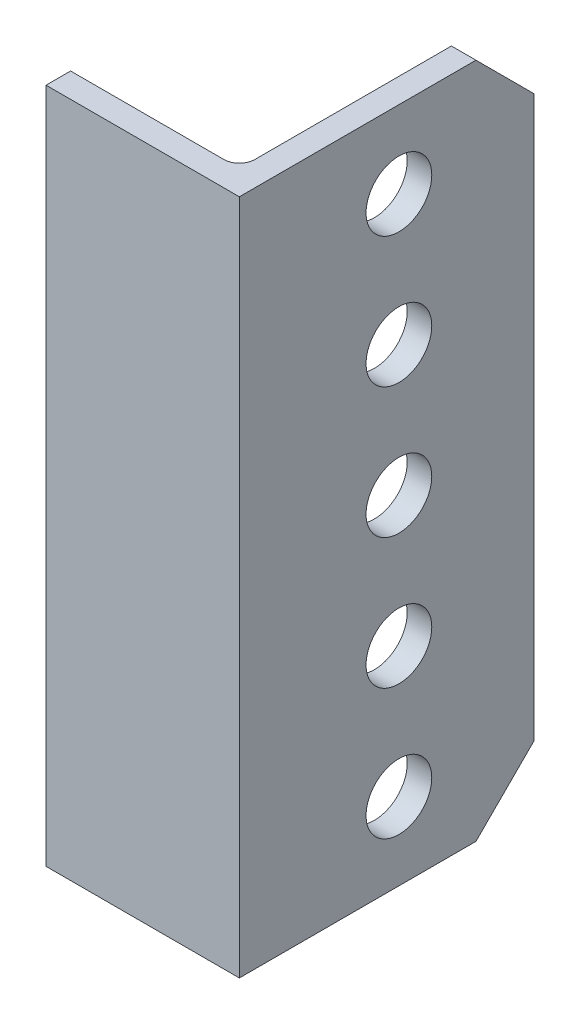
ISO-10303-21;
HEADER;
FILE_DESCRIPTION(('STEP AP214'),'2;1');
FILE_NAME('part.step','',(''),(''),'','','');
FILE_SCHEMA(('AUTOMOTIVE_DESIGN { 1 0 10303 214 1 1 1 1 }'));
ENDSEC;
DATA;
#1=APPLICATION_CONTEXT('core data for automotive mechanical design processes');
#2=APPLICATION_PROTOCOL_DEFINITION('international standard','automotive_design',2000,#1);
#3=PRODUCT_CONTEXT('',#1,'mechanical');
#4=PRODUCT('Part','Part','',(#3));
#5=PRODUCT_RELATED_PRODUCT_CATEGORY('part','',(#4));
#6=PRODUCT_DEFINITION_FORMATION('','',#4);
#7=PRODUCT_DEFINITION_CONTEXT('part definition',#1,'design');
#8=PRODUCT_DEFINITION('design','',#6,#7);
#9=PRODUCT_DEFINITION_SHAPE('','',#8);
#10=(LENGTH_UNIT() NAMED_UNIT(*) SI_UNIT(.MILLI.,.METRE.));
#11=(NAMED_UNIT(*) PLANE_ANGLE_UNIT() SI_UNIT($,.RADIAN.));
#12=(NAMED_UNIT(*) SI_UNIT($,.STERADIAN.) SOLID_ANGLE_UNIT());
#13=UNCERTAINTY_MEASURE_WITH_UNIT(LENGTH_MEASURE(1.E-05),#10,'distance_accuracy_value','');
#14=(GEOMETRIC_REPRESENTATION_CONTEXT(3) GLOBAL_UNCERTAINTY_ASSIGNED_CONTEXT((#13)) GLOBAL_UNIT_ASSIGNED_CONTEXT((#10,
#11,#12)) REPRESENTATION_CONTEXT('',''));
#15=CARTESIAN_POINT('',(0.,0.,0.));
#16=DIRECTION('',(0.,0.,1.));
#17=DIRECTION('',(1.,0.,0.));
#18=AXIS2_PLACEMENT_3D('',#15,#16,#17);
#19=CARTESIAN_POINT('',(-50.,87.5,-6.35));
#20=DIRECTION('',(1.,0.,0.));
#21=DIRECTION('',(0.,0.,-1.));
#22=AXIS2_PLACEMENT_3D('',#19,#20,#21);
#23=PLANE('',#22);
#24=DIRECTION('',(0.,0.,1.));
#25=VECTOR('',#24,1.);
#26=CARTESIAN_POINT('',(-50.,-87.5,-6.35));
#27=LINE('',#26,#25);
#28=CARTESIAN_POINT('',(-50.,-87.5,-6.35));
#29=VERTEX_POINT('',#28);
#30=CARTESIAN_POINT('',(-50.,-87.5,0.));
#31=VERTEX_POINT('',#30);
#32=EDGE_CURVE('E148',#29,#31,#27,.T.);
#33=ORIENTED_EDGE('',*,*,#32,.T.);
#34=DIRECTION('',(0.,-1.,0.));
#35=VECTOR('',#34,1.);
#36=CARTESIAN_POINT('',(-50.,87.5,0.));
#37=LINE('',#36,#35);
#38=CARTESIAN_POINT('',(-50.,87.5,0.));
#39=VERTEX_POINT('',#38);
#40=EDGE_CURVE('E178',#39,#31,#37,.T.);
#41=ORIENTED_EDGE('',*,*,#40,.F.);
#42=DIRECTION('',(0.,0.,1.));
#43=VECTOR('',#42,1.);
#44=CARTESIAN_POINT('',(-50.,87.5,-6.35));
#45=LINE('',#44,#43);
#46=CARTESIAN_POINT('',(-50.,87.5,-6.35));
#47=VERTEX_POINT('',#46);
#48=EDGE_CURVE('E140',#47,#39,#45,.T.);
#49=ORIENTED_EDGE('',*,*,#48,.F.);
#50=DIRECTION('',(0.,-1.,0.));
#51=VECTOR('',#50,1.);
#52=CARTESIAN_POINT('',(-50.,87.5,-6.35));
#53=LINE('',#52,#51);
#54=EDGE_CURVE('E147',#47,#29,#53,.T.);
#55=ORIENTED_EDGE('',*,*,#54,.T.);
#56=EDGE_LOOP('',(#33,#41,#49,#55));
#57=FACE_BOUND('',#56,.T.);
#58=ADVANCED_FACE('F39',(#57),#23,.F.);
#59=CARTESIAN_POINT('',(-50.,87.5,0.));
#60=DIRECTION('',(0.,0.,-1.));
#61=DIRECTION('',(-1.,0.,0.));
#62=AXIS2_PLACEMENT_3D('',#59,#60,#61);
#63=PLANE('',#62);
#64=DIRECTION('',(1.,0.,0.));
#65=VECTOR('',#64,1.);
#66=CARTESIAN_POINT('',(-50.,-87.5,0.));
#67=LINE('',#66,#65);
#68=CARTESIAN_POINT('',(0.,-87.5,0.));
#69=VERTEX_POINT('',#68);
#70=EDGE_CURVE('E151',#31,#69,#67,.T.);
#71=ORIENTED_EDGE('',*,*,#70,.T.);
#72=DIRECTION('',(0.,-1.,0.));
#73=VECTOR('',#72,1.);
#74=CARTESIAN_POINT('',(0.,87.5,0.));
#75=LINE('',#74,#73);
#76=CARTESIAN_POINT('',(0.,87.5,0.));
#77=VERTEX_POINT('',#76);
#78=EDGE_CURVE('E176',#77,#69,#75,.T.);
#79=ORIENTED_EDGE('',*,*,#78,.F.);
#80=DIRECTION('',(1.,0.,0.));
#81=VECTOR('',#80,1.);
#82=CARTESIAN_POINT('',(-50.,87.5,0.));
#83=LINE('',#82,#81);
#84=EDGE_CURVE('E134',#39,#77,#83,.T.);
#85=ORIENTED_EDGE('',*,*,#84,.F.);
#86=ORIENTED_EDGE('',*,*,#40,.T.);
#87=EDGE_LOOP('',(#71,#79,#85,#86));
#88=FACE_BOUND('',#87,.T.);
#89=ADVANCED_FACE('F214',(#88),#63,.F.);
#90=CARTESIAN_POINT('',(0.,87.5,0.));
#91=DIRECTION('',(-1.,0.,0.));
#92=DIRECTION('',(0.,0.,1.));
#93=AXIS2_PLACEMENT_3D('',#90,#91,#92);
#94=PLANE('',#93);
#95=CARTESIAN_POINT('',(0.,-67.5,-41.27));
#96=DIRECTION('',(1.,0.,0.));
#97=DIRECTION('',(0.,0.,-1.));
#98=AXIS2_PLACEMENT_3D('',#95,#96,#97);
#99=CIRCLE('',#98,8.49999999999999);
#100=CARTESIAN_POINT('',(0.,-67.5,-49.77));
#101=VERTEX_POINT('',#100);
#102=EDGE_CURVE('E129',#101,#101,#99,.T.);
#103=ORIENTED_EDGE('',*,*,#102,.F.);
#104=EDGE_LOOP('',(#103));
#105=FACE_BOUND('',#104,.T.);
#106=CARTESIAN_POINT('',(0.,-33.75,-41.27));
#107=DIRECTION('',(1.,0.,0.));
#108=DIRECTION('',(0.,0.,-1.));
#109=AXIS2_PLACEMENT_3D('',#106,#107,#108);
#110=CIRCLE('',#109,8.5);
#111=CARTESIAN_POINT('',(0.,-33.75,-49.77));
#112=VERTEX_POINT('',#111);
#113=EDGE_CURVE('E250',#112,#112,#110,.T.);
#114=ORIENTED_EDGE('',*,*,#113,.F.);
#115=EDGE_LOOP('',(#114));
#116=FACE_BOUND('',#115,.T.);
#117=CARTESIAN_POINT('',(0.,0.,-41.27));
#118=DIRECTION('',(1.,0.,0.));
#119=DIRECTION('',(0.,0.,-1.));
#120=AXIS2_PLACEMENT_3D('',#117,#118,#119);
#121=CIRCLE('',#120,8.5);
#122=CARTESIAN_POINT('',(0.,0.,-49.77));
#123=VERTEX_POINT('',#122);
#124=EDGE_CURVE('E253',#123,#123,#121,.T.);
#125=ORIENTED_EDGE('',*,*,#124,.F.);
#126=EDGE_LOOP('',(#125));
#127=FACE_BOUND('',#126,.T.);
#128=CARTESIAN_POINT('',(0.,33.75,-41.27));
#129=DIRECTION('',(1.,0.,0.));
#130=DIRECTION('',(0.,0.,-1.));
#131=AXIS2_PLACEMENT_3D('',#128,#129,#130);
#132=CIRCLE('',#131,8.5);
#133=CARTESIAN_POINT('',(0.,33.75,-49.77));
#134=VERTEX_POINT('',#133);
#135=EDGE_CURVE('E244',#134,#134,#132,.T.);
#136=ORIENTED_EDGE('',*,*,#135,.F.);
#137=EDGE_LOOP('',(#136));
#138=FACE_BOUND('',#137,.T.);
#139=CARTESIAN_POINT('',(0.,67.5,-41.27));
#140=DIRECTION('',(1.,0.,0.));
#141=DIRECTION('',(0.,0.,-1.));
#142=AXIS2_PLACEMENT_3D('',#139,#140,#141);
#143=CIRCLE('',#142,8.49999999999999);
#144=CARTESIAN_POINT('',(0.,67.5,-49.77));
#145=VERTEX_POINT('',#144);
#146=EDGE_CURVE('E241',#145,#145,#143,.T.);
#147=ORIENTED_EDGE('',*,*,#146,.F.);
#148=EDGE_LOOP('',(#147));
#149=FACE_BOUND('',#148,.T.);
#150=DIRECTION('',(0.,0.,-1.));
#151=VECTOR('',#150,1.);
#152=CARTESIAN_POINT('',(0.,-87.5,0.));
#153=LINE('',#152,#151);
#154=CARTESIAN_POINT('',(0.,-87.5,-61.2));
#155=VERTEX_POINT('',#154);
#156=EDGE_CURVE('E153',#69,#155,#153,.T.);
#157=ORIENTED_EDGE('',*,*,#156,.T.);
#158=DIRECTION('',(0.,-0.707106781186548,0.707106781186547));
#159=VECTOR('',#158,1.);
#160=CARTESIAN_POINT('',(0.,-87.5,-61.2));
#161=LINE('',#160,#159);
#162=CARTESIAN_POINT('',(0.,-72.5,-76.2));
#163=VERTEX_POINT('',#162);
#164=EDGE_CURVE('E62',#163,#155,#161,.T.);
#165=ORIENTED_EDGE('',*,*,#164,.F.);
#166=DIRECTION('',(0.,-1.,0.));
#167=VECTOR('',#166,1.);
#168=CARTESIAN_POINT('',(0.,87.5,-76.2));
#169=LINE('',#168,#167);
#170=CARTESIAN_POINT('',(0.,72.5,-76.2));
#171=VERTEX_POINT('',#170);
#172=EDGE_CURVE('E128',#171,#163,#169,.T.);
#173=ORIENTED_EDGE('',*,*,#172,.F.);
#174=DIRECTION('',(0.,-0.707106781186548,-0.707106781186547));
#175=VECTOR('',#174,1.);
#176=CARTESIAN_POINT('',(0.,72.5,-76.2));
#177=LINE('',#176,#175);
#178=CARTESIAN_POINT('',(0.,87.5,-61.2));
#179=VERTEX_POINT('',#178);
#180=EDGE_CURVE('E115',#179,#171,#177,.T.);
#181=ORIENTED_EDGE('',*,*,#180,.F.);
#182=DIRECTION('',(0.,0.,-1.));
#183=VECTOR('',#182,1.);
#184=CARTESIAN_POINT('',(0.,87.5,0.));
#185=LINE('',#184,#183);
#186=EDGE_CURVE('E126',#77,#179,#185,.T.);
#187=ORIENTED_EDGE('',*,*,#186,.F.);
#188=ORIENTED_EDGE('',*,*,#78,.T.);
#189=EDGE_LOOP('',(#157,#165,#173,#181,#187,#188));
#190=FACE_BOUND('',#189,.T.);
#191=ADVANCED_FACE('F124',(#105,#116,#127,#138,#149,#190),#94,.F.);
#192=CARTESIAN_POINT('',(0.,87.5,-76.2));
#193=DIRECTION('',(0.,0.,1.));
#194=DIRECTION('',(1.,0.,0.));
#195=AXIS2_PLACEMENT_3D('',#192,#193,#194);
#196=PLANE('',#195);
#197=ORIENTED_EDGE('',*,*,#172,.T.);
#198=DIRECTION('',(1.,0.,0.));
#199=VECTOR('',#198,1.);
#200=CARTESIAN_POINT('',(-50.,-72.5,-76.2));
#201=LINE('',#200,#199);
#202=CARTESIAN_POINT('',(-2.35,-72.5,-76.2));
#203=VERTEX_POINT('',#202);
#204=EDGE_CURVE('E246',#203,#163,#201,.T.);
#205=ORIENTED_EDGE('',*,*,#204,.F.);
#206=DIRECTION('',(0.,-1.,0.));
#207=VECTOR('',#206,1.);
#208=CARTESIAN_POINT('',(-2.34999999999997,87.5,-76.2));
#209=LINE('',#208,#207);
#210=CARTESIAN_POINT('',(-2.35,72.5,-76.2));
#211=VERTEX_POINT('',#210);
#212=EDGE_CURVE('E172',#211,#203,#209,.T.);
#213=ORIENTED_EDGE('',*,*,#212,.F.);
#214=DIRECTION('',(1.,0.,0.));
#215=VECTOR('',#214,1.);
#216=CARTESIAN_POINT('',(-50.,72.5,-76.2));
#217=LINE('',#216,#215);
#218=EDGE_CURVE('E130',#211,#171,#217,.T.);
#219=ORIENTED_EDGE('',*,*,#218,.T.);
#220=EDGE_LOOP('',(#197,#205,#213,#219));
#221=FACE_BOUND('',#220,.T.);
#222=ADVANCED_FACE('F264',(#221),#196,.F.);
#223=CARTESIAN_POINT('',(-2.35,87.5,-72.2));
#224=DIRECTION('',(0.,-1.,0.));
#225=DIRECTION('',(0.,0.,-1.));
#226=AXIS2_PLACEMENT_3D('',#223,#224,#225);
#227=CYLINDRICAL_SURFACE('',#226,4.);
#228=ORIENTED_EDGE('',*,*,#212,.T.);
#229=CARTESIAN_POINT('',(-2.35,-76.5,-72.2));
#230=DIRECTION('',(0.,0.707106781186547,0.707106781186548));
#231=DIRECTION('',(0.,-0.707106781186548,0.707106781186547));
#232=AXIS2_PLACEMENT_3D('',#229,#230,#231);
#233=ELLIPSE('',#232,5.65685424949239,4.);
#234=CARTESIAN_POINT('',(-6.35,-76.5000000000001,-72.2));
#235=VERTEX_POINT('',#234);
#236=EDGE_CURVE('E235',#203,#235,#233,.T.);
#237=ORIENTED_EDGE('',*,*,#236,.T.);
#238=DIRECTION('',(0.,-1.,0.));
#239=VECTOR('',#238,1.);
#240=CARTESIAN_POINT('',(-6.35,87.5,-72.2));
#241=LINE('',#240,#239);
#242=CARTESIAN_POINT('',(-6.35,76.5,-72.2));
#243=VERTEX_POINT('',#242);
#244=EDGE_CURVE('E169',#243,#235,#241,.T.);
#245=ORIENTED_EDGE('',*,*,#244,.F.);
#246=CARTESIAN_POINT('',(-2.35,76.5,-72.2));
#247=DIRECTION('',(0.,-0.707106781186547,0.707106781186548));
#248=DIRECTION('',(0.,-0.707106781186548,-0.707106781186547));
#249=AXIS2_PLACEMENT_3D('',#246,#247,#248);
#250=ELLIPSE('',#249,5.65685424949239,4.);
#251=EDGE_CURVE('E186',#243,#211,#250,.T.);
#252=ORIENTED_EDGE('',*,*,#251,.T.);
#253=EDGE_LOOP('',(#228,#237,#245,#252));
#254=FACE_BOUND('',#253,.T.);
#255=ADVANCED_FACE('F278',(#254),#227,.T.);
#256=CARTESIAN_POINT('',(-6.35,87.5,-72.2));
#257=DIRECTION('',(1.,0.,0.));
#258=DIRECTION('',(0.,0.,-1.));
#259=AXIS2_PLACEMENT_3D('',#256,#257,#258);
#260=PLANE('',#259);
#261=CARTESIAN_POINT('',(-6.34999999999999,-67.5,-41.27));
#262=DIRECTION('',(1.,0.,0.));
#263=DIRECTION('',(0.,0.,-1.));
#264=AXIS2_PLACEMENT_3D('',#261,#262,#263);
#265=CIRCLE('',#264,8.49999999999999);
#266=CARTESIAN_POINT('',(-6.35,-67.5,-49.77));
#267=VERTEX_POINT('',#266);
#268=EDGE_CURVE('E42',#267,#267,#265,.T.);
#269=ORIENTED_EDGE('',*,*,#268,.T.);
#270=EDGE_LOOP('',(#269));
#271=FACE_BOUND('',#270,.T.);
#272=CARTESIAN_POINT('',(-6.34999999999999,-33.75,-41.27));
#273=DIRECTION('',(1.,0.,0.));
#274=DIRECTION('',(0.,0.,-1.));
#275=AXIS2_PLACEMENT_3D('',#272,#273,#274);
#276=CIRCLE('',#275,8.5);
#277=CARTESIAN_POINT('',(-6.35,-33.75,-49.77));
#278=VERTEX_POINT('',#277);
#279=EDGE_CURVE('E191',#278,#278,#276,.T.);
#280=ORIENTED_EDGE('',*,*,#279,.T.);
#281=EDGE_LOOP('',(#280));
#282=FACE_BOUND('',#281,.T.);
#283=CARTESIAN_POINT('',(-6.34999999999999,0.,-41.27));
#284=DIRECTION('',(1.,0.,0.));
#285=DIRECTION('',(0.,0.,-1.));
#286=AXIS2_PLACEMENT_3D('',#283,#284,#285);
#287=CIRCLE('',#286,8.5);
#288=CARTESIAN_POINT('',(-6.35,0.,-49.77));
#289=VERTEX_POINT('',#288);
#290=EDGE_CURVE('E189',#289,#289,#287,.T.);
#291=ORIENTED_EDGE('',*,*,#290,.T.);
#292=EDGE_LOOP('',(#291));
#293=FACE_BOUND('',#292,.T.);
#294=CARTESIAN_POINT('',(-6.34999999999999,33.75,-41.27));
#295=DIRECTION('',(1.,0.,0.));
#296=DIRECTION('',(0.,0.,-1.));
#297=AXIS2_PLACEMENT_3D('',#294,#295,#296);
#298=CIRCLE('',#297,8.5);
#299=CARTESIAN_POINT('',(-6.35,33.75,-49.77));
#300=VERTEX_POINT('',#299);
#301=EDGE_CURVE('E185',#300,#300,#298,.T.);
#302=ORIENTED_EDGE('',*,*,#301,.T.);
#303=EDGE_LOOP('',(#302));
#304=FACE_BOUND('',#303,.T.);
#305=CARTESIAN_POINT('',(-6.34999999999999,67.5,-41.27));
#306=DIRECTION('',(1.,0.,0.));
#307=DIRECTION('',(0.,0.,-1.));
#308=AXIS2_PLACEMENT_3D('',#305,#306,#307);
#309=CIRCLE('',#308,8.49999999999999);
#310=CARTESIAN_POINT('',(-6.35,67.5,-49.77));
#311=VERTEX_POINT('',#310);
#312=EDGE_CURVE('E182',#311,#311,#309,.T.);
#313=ORIENTED_EDGE('',*,*,#312,.T.);
#314=EDGE_LOOP('',(#313));
#315=FACE_BOUND('',#314,.T.);
#316=ORIENTED_EDGE('',*,*,#244,.T.);
#317=DIRECTION('',(0.,-0.707106781186548,0.707106781186547));
#318=VECTOR('',#317,1.);
#319=CARTESIAN_POINT('',(-6.35000000000001,5.50000000000005,-154.2));
#320=LINE('',#319,#318);
#321=CARTESIAN_POINT('',(-6.34999999999999,-87.5,-61.2));
#322=VERTEX_POINT('',#321);
#323=EDGE_CURVE('E238',#235,#322,#320,.T.);
#324=ORIENTED_EDGE('',*,*,#323,.T.);
#325=DIRECTION('',(0.,0.,1.));
#326=VECTOR('',#325,1.);
#327=CARTESIAN_POINT('',(-6.35,-87.5,-72.2));
#328=LINE('',#327,#326);
#329=CARTESIAN_POINT('',(-6.34999999999999,-87.5,-10.35));
#330=VERTEX_POINT('',#329);
#331=EDGE_CURVE('E155',#322,#330,#328,.T.);
#332=ORIENTED_EDGE('',*,*,#331,.T.);
#333=DIRECTION('',(0.,-1.,0.));
#334=VECTOR('',#333,1.);
#335=CARTESIAN_POINT('',(-6.34999999999999,87.5,-10.35));
#336=LINE('',#335,#334);
#337=CARTESIAN_POINT('',(-6.34999999999999,87.5,-10.35));
#338=VERTEX_POINT('',#337);
#339=EDGE_CURVE('E166',#338,#330,#336,.T.);
#340=ORIENTED_EDGE('',*,*,#339,.F.);
#341=DIRECTION('',(0.,0.,1.));
#342=VECTOR('',#341,1.);
#343=CARTESIAN_POINT('',(-6.35,87.5,-72.2));
#344=LINE('',#343,#342);
#345=CARTESIAN_POINT('',(-6.35,87.5,-61.2));
#346=VERTEX_POINT('',#345);
#347=EDGE_CURVE('E136',#346,#338,#344,.T.);
#348=ORIENTED_EDGE('',*,*,#347,.F.);
#349=DIRECTION('',(0.,-0.707106781186548,-0.707106781186547));
#350=VECTOR('',#349,1.);
#351=CARTESIAN_POINT('',(-6.35,82.,-66.7));
#352=LINE('',#351,#350);
#353=EDGE_CURVE('E54',#346,#243,#352,.T.);
#354=ORIENTED_EDGE('',*,*,#353,.T.);
#355=EDGE_LOOP('',(#316,#324,#332,#340,#348,#354));
#356=FACE_BOUND('',#355,.T.);
#357=ADVANCED_FACE('F198',(#271,#282,#293,#304,#315,#356),#260,.F.);
#358=CARTESIAN_POINT('',(-10.35,87.5,-10.35));
#359=DIRECTION('',(0.,-1.,0.));
#360=DIRECTION('',(0.,0.,-1.));
#361=AXIS2_PLACEMENT_3D('',#358,#359,#360);
#362=CYLINDRICAL_SURFACE('',#361,4.);
#363=CARTESIAN_POINT('',(-10.35,-87.5,-10.35));
#364=DIRECTION('',(0.,-1.,0.));
#365=DIRECTION('',(0.,0.,-1.));
#366=AXIS2_PLACEMENT_3D('',#363,#364,#365);
#367=CIRCLE('',#366,4.);
#368=CARTESIAN_POINT('',(-10.35,-87.5,-6.35));
#369=VERTEX_POINT('',#368);
#370=EDGE_CURVE('E157',#330,#369,#367,.T.);
#371=ORIENTED_EDGE('',*,*,#370,.T.);
#372=DIRECTION('',(0.,-1.,0.));
#373=VECTOR('',#372,1.);
#374=CARTESIAN_POINT('',(-10.35,87.5,-6.35));
#375=LINE('',#374,#373);
#376=CARTESIAN_POINT('',(-10.35,87.5,-6.35));
#377=VERTEX_POINT('',#376);
#378=EDGE_CURVE('E163',#377,#369,#375,.T.);
#379=ORIENTED_EDGE('',*,*,#378,.F.);
#380=CARTESIAN_POINT('',(-10.35,87.5,-10.35));
#381=DIRECTION('',(0.,-1.,0.));
#382=DIRECTION('',(0.,0.,-1.));
#383=AXIS2_PLACEMENT_3D('',#380,#381,#382);
#384=CIRCLE('',#383,4.);
#385=EDGE_CURVE('E138',#338,#377,#384,.T.);
#386=ORIENTED_EDGE('',*,*,#385,.F.);
#387=ORIENTED_EDGE('',*,*,#339,.T.);
#388=EDGE_LOOP('',(#371,#379,#386,#387));
#389=FACE_BOUND('',#388,.T.);
#390=ADVANCED_FACE('F277',(#389),#362,.F.);
#391=CARTESIAN_POINT('',(-10.35,87.5,-6.35000000000001));
#392=DIRECTION('',(0.,0.,1.));
#393=DIRECTION('',(1.,0.,0.));
#394=AXIS2_PLACEMENT_3D('',#391,#392,#393);
#395=PLANE('',#394);
#396=DIRECTION('',(-1.,0.,0.));
#397=VECTOR('',#396,1.);
#398=CARTESIAN_POINT('',(-10.35,-87.5,-6.35000000000001));
#399=LINE('',#398,#397);
#400=EDGE_CURVE('E159',#369,#29,#399,.T.);
#401=ORIENTED_EDGE('',*,*,#400,.T.);
#402=ORIENTED_EDGE('',*,*,#54,.F.);
#403=DIRECTION('',(-1.,0.,0.));
#404=VECTOR('',#403,1.);
#405=CARTESIAN_POINT('',(-10.35,87.5,-6.35000000000001));
#406=LINE('',#405,#404);
#407=EDGE_CURVE('E145',#377,#47,#406,.T.);
#408=ORIENTED_EDGE('',*,*,#407,.F.);
#409=ORIENTED_EDGE('',*,*,#378,.T.);
#410=EDGE_LOOP('',(#401,#402,#408,#409));
#411=FACE_BOUND('',#410,.T.);
#412=ADVANCED_FACE('F295',(#411),#395,.F.);
#413=CARTESIAN_POINT('',(-2.35,87.5,-72.2));
#414=DIRECTION('',(0.,1.,0.));
#415=DIRECTION('',(0.,0.,1.));
#416=AXIS2_PLACEMENT_3D('',#413,#414,#415);
#417=PLANE('',#416);
#418=DIRECTION('',(1.,0.,0.));
#419=VECTOR('',#418,1.);
#420=CARTESIAN_POINT('',(-2.35,87.5,-61.2));
#421=LINE('',#420,#419);
#422=EDGE_CURVE('E11',#346,#179,#421,.T.);
#423=ORIENTED_EDGE('',*,*,#422,.F.);
#424=ORIENTED_EDGE('',*,*,#347,.T.);
#425=ORIENTED_EDGE('',*,*,#385,.T.);
#426=ORIENTED_EDGE('',*,*,#407,.T.);
#427=ORIENTED_EDGE('',*,*,#48,.T.);
#428=ORIENTED_EDGE('',*,*,#84,.T.);
#429=ORIENTED_EDGE('',*,*,#186,.T.);
#430=EDGE_LOOP('',(#423,#424,#425,#426,#427,#428,#429));
#431=FACE_BOUND('',#430,.T.);
#432=ADVANCED_FACE('F132',(#431),#417,.T.);
#433=CARTESIAN_POINT('',(-2.35,-87.5,-72.2));
#434=DIRECTION('',(0.,1.,0.));
#435=DIRECTION('',(0.,0.,1.));
#436=AXIS2_PLACEMENT_3D('',#433,#434,#435);
#437=PLANE('',#436);
#438=ORIENTED_EDGE('',*,*,#331,.F.);
#439=DIRECTION('',(1.,0.,0.));
#440=VECTOR('',#439,1.);
#441=CARTESIAN_POINT('',(-2.35,-87.5,-61.2));
#442=LINE('',#441,#440);
#443=EDGE_CURVE('E47',#322,#155,#442,.T.);
#444=ORIENTED_EDGE('',*,*,#443,.T.);
#445=ORIENTED_EDGE('',*,*,#156,.F.);
#446=ORIENTED_EDGE('',*,*,#70,.F.);
#447=ORIENTED_EDGE('',*,*,#32,.F.);
#448=ORIENTED_EDGE('',*,*,#400,.F.);
#449=ORIENTED_EDGE('',*,*,#370,.F.);
#450=EDGE_LOOP('',(#438,#444,#445,#446,#447,#448,#449));
#451=FACE_BOUND('',#450,.T.);
#452=ADVANCED_FACE('F227',(#451),#437,.F.);
#453=CARTESIAN_POINT('',(-50.,-87.5,-61.2));
#454=DIRECTION('',(0.,0.707106781186547,0.707106781186548));
#455=DIRECTION('',(0.,-0.707106781186548,0.707106781186547));
#456=AXIS2_PLACEMENT_3D('',#453,#454,#455);
#457=PLANE('',#456);
#458=ORIENTED_EDGE('',*,*,#204,.T.);
#459=ORIENTED_EDGE('',*,*,#164,.T.);
#460=ORIENTED_EDGE('',*,*,#443,.F.);
#461=ORIENTED_EDGE('',*,*,#323,.F.);
#462=ORIENTED_EDGE('',*,*,#236,.F.);
#463=EDGE_LOOP('',(#458,#459,#460,#461,#462));
#464=FACE_BOUND('',#463,.T.);
#465=ADVANCED_FACE('F284',(#464),#457,.F.);
#466=CARTESIAN_POINT('',(-50.,72.5,-76.2));
#467=DIRECTION('',(0.,-0.707106781186547,0.707106781186548));
#468=DIRECTION('',(0.,-0.707106781186548,-0.707106781186547));
#469=AXIS2_PLACEMENT_3D('',#466,#467,#468);
#470=PLANE('',#469);
#471=ORIENTED_EDGE('',*,*,#353,.F.);
#472=ORIENTED_EDGE('',*,*,#422,.T.);
#473=ORIENTED_EDGE('',*,*,#180,.T.);
#474=ORIENTED_EDGE('',*,*,#218,.F.);
#475=ORIENTED_EDGE('',*,*,#251,.F.);
#476=EDGE_LOOP('',(#471,#472,#473,#474,#475));
#477=FACE_BOUND('',#476,.T.);
#478=ADVANCED_FACE('F114',(#477),#470,.F.);
#479=CARTESIAN_POINT('',(-50.,67.5,-41.27));
#480=DIRECTION('',(1.,0.,0.));
#481=DIRECTION('',(0.,0.,-1.));
#482=AXIS2_PLACEMENT_3D('',#479,#480,#481);
#483=CYLINDRICAL_SURFACE('',#482,8.49999999999999);
#484=ORIENTED_EDGE('',*,*,#146,.T.);
#485=EDGE_LOOP('',(#484));
#486=FACE_BOUND('',#485,.T.);
#487=ORIENTED_EDGE('',*,*,#312,.F.);
#488=EDGE_LOOP('',(#487));
#489=FACE_BOUND('',#488,.T.);
#490=ADVANCED_FACE('F269',(#486,#489),#483,.F.);
#491=CARTESIAN_POINT('',(-50.,33.75,-41.27));
#492=DIRECTION('',(1.,0.,0.));
#493=DIRECTION('',(0.,0.,-1.));
#494=AXIS2_PLACEMENT_3D('',#491,#492,#493);
#495=CYLINDRICAL_SURFACE('',#494,8.5);
#496=ORIENTED_EDGE('',*,*,#135,.T.);
#497=EDGE_LOOP('',(#496));
#498=FACE_BOUND('',#497,.T.);
#499=ORIENTED_EDGE('',*,*,#301,.F.);
#500=EDGE_LOOP('',(#499));
#501=FACE_BOUND('',#500,.T.);
#502=ADVANCED_FACE('F259',(#498,#501),#495,.F.);
#503=CARTESIAN_POINT('',(-50.,0.,-41.27));
#504=DIRECTION('',(1.,0.,0.));
#505=DIRECTION('',(0.,0.,-1.));
#506=AXIS2_PLACEMENT_3D('',#503,#504,#505);
#507=CYLINDRICAL_SURFACE('',#506,8.5);
#508=ORIENTED_EDGE('',*,*,#124,.T.);
#509=EDGE_LOOP('',(#508));
#510=FACE_BOUND('',#509,.T.);
#511=ORIENTED_EDGE('',*,*,#290,.F.);
#512=EDGE_LOOP('',(#511));
#513=FACE_BOUND('',#512,.T.);
#514=ADVANCED_FACE('F208',(#510,#513),#507,.F.);
#515=CARTESIAN_POINT('',(-50.,-33.75,-41.27));
#516=DIRECTION('',(1.,0.,0.));
#517=DIRECTION('',(0.,0.,-1.));
#518=AXIS2_PLACEMENT_3D('',#515,#516,#517);
#519=CYLINDRICAL_SURFACE('',#518,8.5);
#520=ORIENTED_EDGE('',*,*,#113,.T.);
#521=EDGE_LOOP('',(#520));
#522=FACE_BOUND('',#521,.T.);
#523=ORIENTED_EDGE('',*,*,#279,.F.);
#524=EDGE_LOOP('',(#523));
#525=FACE_BOUND('',#524,.T.);
#526=ADVANCED_FACE('F202',(#522,#525),#519,.F.);
#527=CARTESIAN_POINT('',(-50.,-67.5,-41.27));
#528=DIRECTION('',(1.,0.,0.));
#529=DIRECTION('',(0.,0.,-1.));
#530=AXIS2_PLACEMENT_3D('',#527,#528,#529);
#531=CYLINDRICAL_SURFACE('',#530,8.49999999999999);
#532=ORIENTED_EDGE('',*,*,#102,.T.);
#533=EDGE_LOOP('',(#532));
#534=FACE_BOUND('',#533,.T.);
#535=ORIENTED_EDGE('',*,*,#268,.F.);
#536=EDGE_LOOP('',(#535));
#537=FACE_BOUND('',#536,.T.);
#538=ADVANCED_FACE('F200',(#534,#537),#531,.F.);
#539=CLOSED_SHELL('',(#58,#89,#191,#222,#255,#357,#390,#412,#432,#452,#465,#478,#490,#502,#514,
#526,#538));
#540=MANIFOLD_SOLID_BREP('B2',#539);
#541=ADVANCED_BREP_SHAPE_REPRESENTATION('',(#18,#540),#14);
#542=SHAPE_DEFINITION_REPRESENTATION(#9,#541);
ENDSEC;
END-ISO-10303-21;
